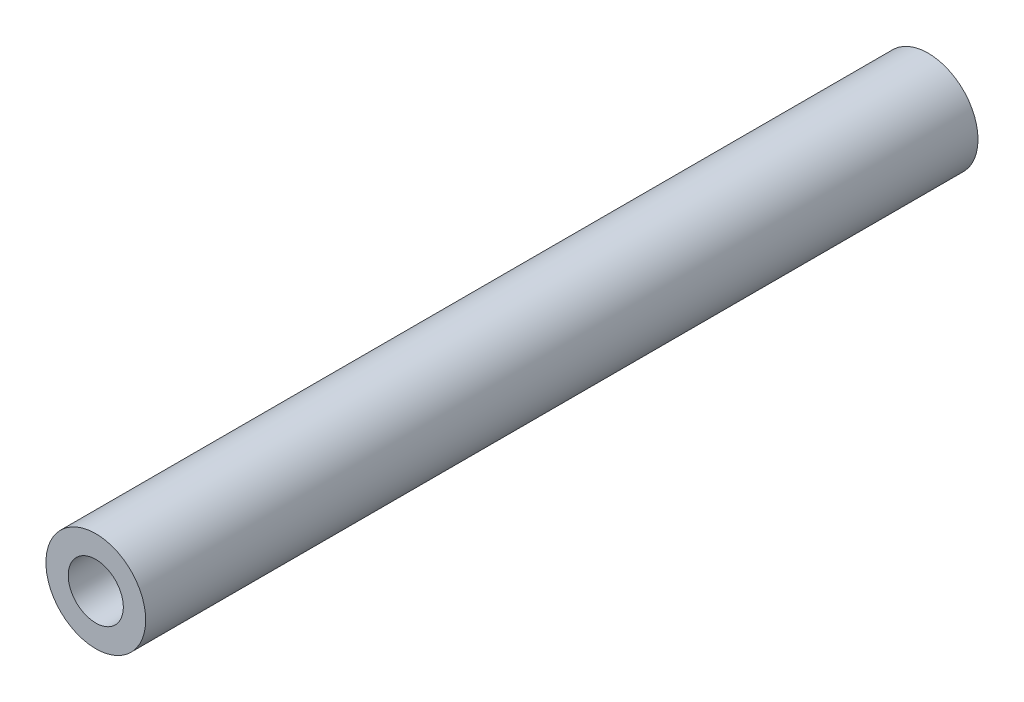
ISO-10303-21;
HEADER;
FILE_DESCRIPTION(('STEP AP214'),'2;1');
FILE_NAME('part.step','',(''),(''),'','','');
FILE_SCHEMA(('AUTOMOTIVE_DESIGN { 1 0 10303 214 1 1 1 1 }'));
ENDSEC;
DATA;
#1=APPLICATION_CONTEXT('core data for automotive mechanical design processes');
#2=APPLICATION_PROTOCOL_DEFINITION('international standard','automotive_design',2000,#1);
#3=PRODUCT_CONTEXT('',#1,'mechanical');
#4=PRODUCT('Part','Part','',(#3));
#5=PRODUCT_RELATED_PRODUCT_CATEGORY('part','',(#4));
#6=PRODUCT_DEFINITION_FORMATION('','',#4);
#7=PRODUCT_DEFINITION_CONTEXT('part definition',#1,'design');
#8=PRODUCT_DEFINITION('design','',#6,#7);
#9=PRODUCT_DEFINITION_SHAPE('','',#8);
#10=(LENGTH_UNIT() NAMED_UNIT(*) SI_UNIT(.MILLI.,.METRE.));
#11=(NAMED_UNIT(*) PLANE_ANGLE_UNIT() SI_UNIT($,.RADIAN.));
#12=(NAMED_UNIT(*) SI_UNIT($,.STERADIAN.) SOLID_ANGLE_UNIT());
#13=UNCERTAINTY_MEASURE_WITH_UNIT(LENGTH_MEASURE(1.E-05),#10,'distance_accuracy_value','');
#14=(GEOMETRIC_REPRESENTATION_CONTEXT(3) GLOBAL_UNCERTAINTY_ASSIGNED_CONTEXT((#13)) GLOBAL_UNIT_ASSIGNED_CONTEXT((#10,
#11,#12)) REPRESENTATION_CONTEXT('',''));
#15=CARTESIAN_POINT('',(0.,0.,0.));
#16=DIRECTION('',(0.,0.,1.));
#17=DIRECTION('',(1.,0.,0.));
#18=AXIS2_PLACEMENT_3D('',#15,#16,#17);
#19=CARTESIAN_POINT('',(0.,0.,24.91));
#20=DIRECTION('',(0.,0.,-1.));
#21=DIRECTION('',(-1.,0.,0.));
#22=AXIS2_PLACEMENT_3D('',#19,#20,#21);
#23=CYLINDRICAL_SURFACE('',#22,2.985);
#24=CARTESIAN_POINT('',(0.,0.,24.91));
#25=DIRECTION('',(0.,0.,1.));
#26=DIRECTION('',(1.,0.,0.));
#27=AXIS2_PLACEMENT_3D('',#24,#25,#26);
#28=CIRCLE('',#27,2.985);
#29=CARTESIAN_POINT('',(2.985,0.,24.91));
#30=VERTEX_POINT('',#29);
#31=EDGE_CURVE('E10',#30,#30,#28,.T.);
#32=ORIENTED_EDGE('',*,*,#31,.F.);
#33=EDGE_LOOP('',(#32));
#34=FACE_BOUND('',#33,.T.);
#35=CARTESIAN_POINT('',(0.,0.,-24.91));
#36=DIRECTION('',(0.,0.,1.));
#37=DIRECTION('',(1.,0.,0.));
#38=AXIS2_PLACEMENT_3D('',#35,#36,#37);
#39=CIRCLE('',#38,2.985);
#40=CARTESIAN_POINT('',(2.985,0.,-24.91));
#41=VERTEX_POINT('',#40);
#42=EDGE_CURVE('E42',#41,#41,#39,.T.);
#43=ORIENTED_EDGE('',*,*,#42,.T.);
#44=EDGE_LOOP('',(#43));
#45=FACE_BOUND('',#44,.T.);
#46=ADVANCED_FACE('F35',(#34,#45),#23,.T.);
#47=CARTESIAN_POINT('',(0.,0.,24.91));
#48=DIRECTION('',(0.,0.,1.));
#49=DIRECTION('',(1.,0.,0.));
#50=AXIS2_PLACEMENT_3D('',#47,#48,#49);
#51=PLANE('',#50);
#52=CARTESIAN_POINT('',(0.,0.,24.91));
#53=DIRECTION('',(0.,0.,1.));
#54=DIRECTION('',(1.,0.,0.));
#55=AXIS2_PLACEMENT_3D('',#52,#53,#54);
#56=CIRCLE('',#55,1.65);
#57=CARTESIAN_POINT('',(1.65,0.,24.91));
#58=VERTEX_POINT('',#57);
#59=EDGE_CURVE('E56',#58,#58,#56,.T.);
#60=ORIENTED_EDGE('',*,*,#59,.F.);
#61=EDGE_LOOP('',(#60));
#62=FACE_BOUND('',#61,.T.);
#63=ORIENTED_EDGE('',*,*,#31,.T.);
#64=EDGE_LOOP('',(#63));
#65=FACE_BOUND('',#64,.T.);
#66=ADVANCED_FACE('F77',(#62,#65),#51,.T.);
#67=CARTESIAN_POINT('',(0.,0.,-24.91));
#68=DIRECTION('',(0.,0.,1.));
#69=DIRECTION('',(1.,0.,0.));
#70=AXIS2_PLACEMENT_3D('',#67,#68,#69);
#71=PLANE('',#70);
#72=CARTESIAN_POINT('',(0.,0.,-24.91));
#73=DIRECTION('',(0.,0.,-1.));
#74=DIRECTION('',(-1.,0.,0.));
#75=AXIS2_PLACEMENT_3D('',#72,#73,#74);
#76=CIRCLE('',#75,1.65);
#77=CARTESIAN_POINT('',(-1.65,0.,-24.91));
#78=VERTEX_POINT('',#77);
#79=EDGE_CURVE('E67',#78,#78,#76,.T.);
#80=ORIENTED_EDGE('',*,*,#79,.F.);
#81=EDGE_LOOP('',(#80));
#82=FACE_BOUND('',#81,.T.);
#83=ORIENTED_EDGE('',*,*,#42,.F.);
#84=EDGE_LOOP('',(#83));
#85=FACE_BOUND('',#84,.T.);
#86=ADVANCED_FACE('F73',(#82,#85),#71,.F.);
#87=CARTESIAN_POINT('',(0.,0.,-24.91));
#88=DIRECTION('',(0.,0.,1.));
#89=DIRECTION('',(1.,0.,0.));
#90=AXIS2_PLACEMENT_3D('',#87,#88,#89);
#91=CYLINDRICAL_SURFACE('',#90,1.6);
#92=CARTESIAN_POINT('',(0.,0.,-12.8799569690486));
#93=DIRECTION('',(0.,0.,-1.));
#94=DIRECTION('',(-1.,0.,0.));
#95=AXIS2_PLACEMENT_3D('',#92,#93,#94);
#96=CIRCLE('',#95,1.6);
#97=CARTESIAN_POINT('',(-1.6,0.,-12.8799569690486));
#98=VERTEX_POINT('',#97);
#99=EDGE_CURVE('E38',#98,#98,#96,.T.);
#100=ORIENTED_EDGE('',*,*,#99,.T.);
#101=EDGE_LOOP('',(#100));
#102=FACE_BOUND('',#101,.T.);
#103=CARTESIAN_POINT('',(0.,0.,12.8799569690486));
#104=DIRECTION('',(0.,0.,1.));
#105=DIRECTION('',(1.,0.,0.));
#106=AXIS2_PLACEMENT_3D('',#103,#104,#105);
#107=CIRCLE('',#106,1.6);
#108=CARTESIAN_POINT('',(1.6,0.,12.8799569690486));
#109=VERTEX_POINT('',#108);
#110=EDGE_CURVE('E47',#109,#109,#107,.T.);
#111=ORIENTED_EDGE('',*,*,#110,.T.);
#112=EDGE_LOOP('',(#111));
#113=FACE_BOUND('',#112,.T.);
#114=ADVANCED_FACE('F76',(#102,#113),#91,.F.);
#115=CARTESIAN_POINT('',(0.,0.,12.91));
#116=DIRECTION('',(0.,0.,1.));
#117=DIRECTION('',(1.,0.,0.));
#118=AXIS2_PLACEMENT_3D('',#115,#116,#117);
#119=CONICAL_SURFACE('',#118,1.65,1.02974425867665);
#120=CARTESIAN_POINT('',(0.,0.,12.91));
#121=DIRECTION('',(0.,0.,1.));
#122=DIRECTION('',(1.,0.,0.));
#123=AXIS2_PLACEMENT_3D('',#120,#121,#122);
#124=CIRCLE('',#123,1.65);
#125=CARTESIAN_POINT('',(1.65,0.,12.91));
#126=VERTEX_POINT('',#125);
#127=EDGE_CURVE('E50',#126,#126,#124,.T.);
#128=ORIENTED_EDGE('',*,*,#127,.T.);
#129=EDGE_LOOP('',(#128));
#130=FACE_BOUND('',#129,.T.);
#131=ORIENTED_EDGE('',*,*,#110,.F.);
#132=EDGE_LOOP('',(#131));
#133=FACE_BOUND('',#132,.T.);
#134=ADVANCED_FACE('F92',(#130,#133),#119,.F.);
#135=CARTESIAN_POINT('',(0.,0.,24.91));
#136=DIRECTION('',(0.,0.,1.));
#137=DIRECTION('',(1.,0.,0.));
#138=AXIS2_PLACEMENT_3D('',#135,#136,#137);
#139=CYLINDRICAL_SURFACE('',#138,1.65);
#140=ORIENTED_EDGE('',*,*,#127,.F.);
#141=EDGE_LOOP('',(#140));
#142=FACE_BOUND('',#141,.T.);
#143=ORIENTED_EDGE('',*,*,#59,.T.);
#144=EDGE_LOOP('',(#143));
#145=FACE_BOUND('',#144,.T.);
#146=ADVANCED_FACE('F96',(#142,#145),#139,.F.);
#147=CARTESIAN_POINT('',(0.,0.,-12.91));
#148=DIRECTION('',(0.,0.,-1.));
#149=DIRECTION('',(-1.,0.,0.));
#150=AXIS2_PLACEMENT_3D('',#147,#148,#149);
#151=CONICAL_SURFACE('',#150,1.65,1.02974425867665);
#152=CARTESIAN_POINT('',(0.,0.,-12.91));
#153=DIRECTION('',(0.,0.,-1.));
#154=DIRECTION('',(-1.,0.,0.));
#155=AXIS2_PLACEMENT_3D('',#152,#153,#154);
#156=CIRCLE('',#155,1.65);
#157=CARTESIAN_POINT('',(-1.65,0.,-12.91));
#158=VERTEX_POINT('',#157);
#159=EDGE_CURVE('E63',#158,#158,#156,.T.);
#160=ORIENTED_EDGE('',*,*,#159,.T.);
#161=EDGE_LOOP('',(#160));
#162=FACE_BOUND('',#161,.T.);
#163=ORIENTED_EDGE('',*,*,#99,.F.);
#164=EDGE_LOOP('',(#163));
#165=FACE_BOUND('',#164,.T.);
#166=ADVANCED_FACE('F99',(#162,#165),#151,.F.);
#167=CARTESIAN_POINT('',(0.,0.,-24.91));
#168=DIRECTION('',(0.,0.,-1.));
#169=DIRECTION('',(-1.,0.,0.));
#170=AXIS2_PLACEMENT_3D('',#167,#168,#169);
#171=CYLINDRICAL_SURFACE('',#170,1.65);
#172=ORIENTED_EDGE('',*,*,#159,.F.);
#173=EDGE_LOOP('',(#172));
#174=FACE_BOUND('',#173,.T.);
#175=ORIENTED_EDGE('',*,*,#79,.T.);
#176=EDGE_LOOP('',(#175));
#177=FACE_BOUND('',#176,.T.);
#178=ADVANCED_FACE('F71',(#174,#177),#171,.F.);
#179=CLOSED_SHELL('',(#46,#66,#86,#114,#134,#146,#166,#178));
#180=MANIFOLD_SOLID_BREP('B2',#179);
#181=ADVANCED_BREP_SHAPE_REPRESENTATION('',(#18,#180),#14);
#182=SHAPE_DEFINITION_REPRESENTATION(#9,#181);
ENDSEC;
END-ISO-10303-21;
